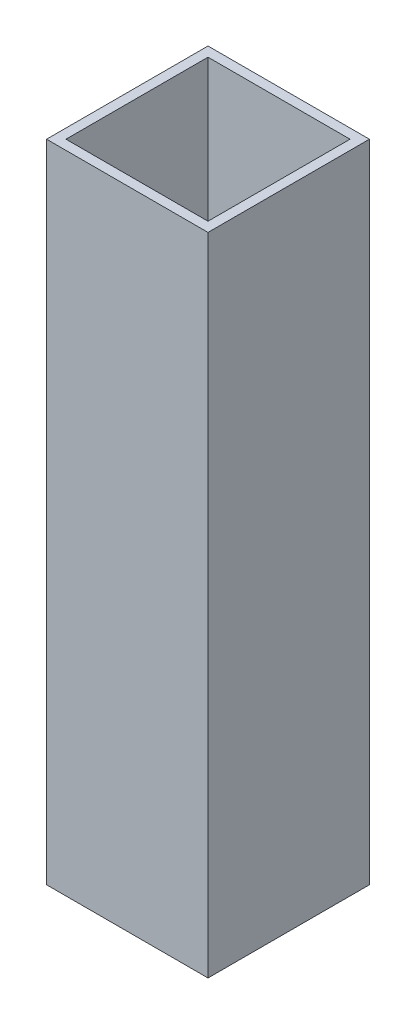
ISO-10303-21;
HEADER;
FILE_DESCRIPTION(('STEP AP214'),'2;1');
FILE_NAME('part.step','',(''),(''),'','','');
FILE_SCHEMA(('AUTOMOTIVE_DESIGN { 1 0 10303 214 1 1 1 1 }'));
ENDSEC;
DATA;
#1=APPLICATION_CONTEXT('core data for automotive mechanical design processes');
#2=APPLICATION_PROTOCOL_DEFINITION('international standard','automotive_design',2000,#1);
#3=PRODUCT_CONTEXT('',#1,'mechanical');
#4=PRODUCT('Part','Part','',(#3));
#5=PRODUCT_RELATED_PRODUCT_CATEGORY('part','',(#4));
#6=PRODUCT_DEFINITION_FORMATION('','',#4);
#7=PRODUCT_DEFINITION_CONTEXT('part definition',#1,'design');
#8=PRODUCT_DEFINITION('design','',#6,#7);
#9=PRODUCT_DEFINITION_SHAPE('','',#8);
#10=(LENGTH_UNIT() NAMED_UNIT(*) SI_UNIT(.MILLI.,.METRE.));
#11=(NAMED_UNIT(*) PLANE_ANGLE_UNIT() SI_UNIT($,.RADIAN.));
#12=(NAMED_UNIT(*) SI_UNIT($,.STERADIAN.) SOLID_ANGLE_UNIT());
#13=UNCERTAINTY_MEASURE_WITH_UNIT(LENGTH_MEASURE(1.E-05),#10,'distance_accuracy_value','');
#14=(GEOMETRIC_REPRESENTATION_CONTEXT(3) GLOBAL_UNCERTAINTY_ASSIGNED_CONTEXT((#13)) GLOBAL_UNIT_ASSIGNED_CONTEXT((#10,
#11,#12)) REPRESENTATION_CONTEXT('',''));
#15=CARTESIAN_POINT('',(0.,0.,0.));
#16=DIRECTION('',(0.,0.,1.));
#17=DIRECTION('',(1.,0.,0.));
#18=AXIS2_PLACEMENT_3D('',#15,#16,#17);
#19=CARTESIAN_POINT('',(12.5,-50.,-12.5));
#20=DIRECTION('',(1.,0.,0.));
#21=DIRECTION('',(0.,0.,-1.));
#22=AXIS2_PLACEMENT_3D('',#19,#20,#21);
#23=PLANE('',#22);
#24=DIRECTION('',(0.,1.,0.));
#25=VECTOR('',#24,1.);
#26=CARTESIAN_POINT('',(12.5,-50.,-12.5));
#27=LINE('',#26,#25);
#28=CARTESIAN_POINT('',(12.5,-50.,-12.5));
#29=VERTEX_POINT('',#28);
#30=CARTESIAN_POINT('',(12.5,50.,-12.5));
#31=VERTEX_POINT('',#30);
#32=EDGE_CURVE('E38',#29,#31,#27,.T.);
#33=ORIENTED_EDGE('',*,*,#32,.T.);
#34=DIRECTION('',(0.,0.,-1.));
#35=VECTOR('',#34,1.);
#36=CARTESIAN_POINT('',(12.5,50.,-12.5));
#37=LINE('',#36,#35);
#38=CARTESIAN_POINT('',(12.5,50.,12.5));
#39=VERTEX_POINT('',#38);
#40=EDGE_CURVE('E130',#39,#31,#37,.T.);
#41=ORIENTED_EDGE('',*,*,#40,.F.);
#42=DIRECTION('',(0.,1.,0.));
#43=VECTOR('',#42,1.);
#44=CARTESIAN_POINT('',(12.5,-50.,12.5));
#45=LINE('',#44,#43);
#46=CARTESIAN_POINT('',(12.5,-50.,12.5));
#47=VERTEX_POINT('',#46);
#48=EDGE_CURVE('E11',#47,#39,#45,.T.);
#49=ORIENTED_EDGE('',*,*,#48,.F.);
#50=DIRECTION('',(0.,0.,-1.));
#51=VECTOR('',#50,1.);
#52=CARTESIAN_POINT('',(12.5,-50.,-12.5));
#53=LINE('',#52,#51);
#54=EDGE_CURVE('E149',#47,#29,#53,.T.);
#55=ORIENTED_EDGE('',*,*,#54,.T.);
#56=EDGE_LOOP('',(#33,#41,#49,#55));
#57=FACE_BOUND('',#56,.T.);
#58=ADVANCED_FACE('F35',(#57),#23,.T.);
#59=CARTESIAN_POINT('',(-12.5,-50.,12.5));
#60=DIRECTION('',(0.,0.,1.));
#61=DIRECTION('',(1.,0.,0.));
#62=AXIS2_PLACEMENT_3D('',#59,#60,#61);
#63=PLANE('',#62);
#64=ORIENTED_EDGE('',*,*,#48,.T.);
#65=DIRECTION('',(1.,0.,0.));
#66=VECTOR('',#65,1.);
#67=CARTESIAN_POINT('',(-12.5,50.,12.5));
#68=LINE('',#67,#66);
#69=CARTESIAN_POINT('',(-12.5,50.,12.5));
#70=VERTEX_POINT('',#69);
#71=EDGE_CURVE('E139',#70,#39,#68,.T.);
#72=ORIENTED_EDGE('',*,*,#71,.F.);
#73=DIRECTION('',(0.,1.,0.));
#74=VECTOR('',#73,1.);
#75=CARTESIAN_POINT('',(-12.5,-50.,12.5));
#76=LINE('',#75,#74);
#77=CARTESIAN_POINT('',(-12.5,-50.,12.5));
#78=VERTEX_POINT('',#77);
#79=EDGE_CURVE('E43',#78,#70,#76,.T.);
#80=ORIENTED_EDGE('',*,*,#79,.F.);
#81=DIRECTION('',(1.,0.,0.));
#82=VECTOR('',#81,1.);
#83=CARTESIAN_POINT('',(-12.5,-50.,12.5));
#84=LINE('',#83,#82);
#85=EDGE_CURVE('E160',#78,#47,#84,.T.);
#86=ORIENTED_EDGE('',*,*,#85,.T.);
#87=EDGE_LOOP('',(#64,#72,#80,#86));
#88=FACE_BOUND('',#87,.T.);
#89=ADVANCED_FACE('F172',(#88),#63,.T.);
#90=CARTESIAN_POINT('',(-12.5,-50.,-12.5));
#91=DIRECTION('',(-1.,0.,0.));
#92=DIRECTION('',(0.,0.,1.));
#93=AXIS2_PLACEMENT_3D('',#90,#91,#92);
#94=PLANE('',#93);
#95=ORIENTED_EDGE('',*,*,#79,.T.);
#96=DIRECTION('',(0.,0.,1.));
#97=VECTOR('',#96,1.);
#98=CARTESIAN_POINT('',(-12.5,50.,-12.5));
#99=LINE('',#98,#97);
#100=CARTESIAN_POINT('',(-12.5,50.,-12.5));
#101=VERTEX_POINT('',#100);
#102=EDGE_CURVE('E136',#101,#70,#99,.T.);
#103=ORIENTED_EDGE('',*,*,#102,.F.);
#104=DIRECTION('',(0.,1.,0.));
#105=VECTOR('',#104,1.);
#106=CARTESIAN_POINT('',(-12.5,-50.,-12.5));
#107=LINE('',#106,#105);
#108=CARTESIAN_POINT('',(-12.5,-50.,-12.5));
#109=VERTEX_POINT('',#108);
#110=EDGE_CURVE('E163',#109,#101,#107,.T.);
#111=ORIENTED_EDGE('',*,*,#110,.F.);
#112=DIRECTION('',(0.,0.,1.));
#113=VECTOR('',#112,1.);
#114=CARTESIAN_POINT('',(-12.5,-50.,-12.5));
#115=LINE('',#114,#113);
#116=EDGE_CURVE('E157',#109,#78,#115,.T.);
#117=ORIENTED_EDGE('',*,*,#116,.T.);
#118=EDGE_LOOP('',(#95,#103,#111,#117));
#119=FACE_BOUND('',#118,.T.);
#120=ADVANCED_FACE('F178',(#119),#94,.T.);
#121=CARTESIAN_POINT('',(-12.5,-50.,-12.5));
#122=DIRECTION('',(0.,0.,-1.));
#123=DIRECTION('',(-1.,0.,0.));
#124=AXIS2_PLACEMENT_3D('',#121,#122,#123);
#125=PLANE('',#124);
#126=ORIENTED_EDGE('',*,*,#110,.T.);
#127=DIRECTION('',(-1.,0.,0.));
#128=VECTOR('',#127,1.);
#129=CARTESIAN_POINT('',(-12.5,50.,-12.5));
#130=LINE('',#129,#128);
#131=EDGE_CURVE('E133',#31,#101,#130,.T.);
#132=ORIENTED_EDGE('',*,*,#131,.F.);
#133=ORIENTED_EDGE('',*,*,#32,.F.);
#134=DIRECTION('',(-1.,0.,0.));
#135=VECTOR('',#134,1.);
#136=CARTESIAN_POINT('',(-12.5,-50.,-12.5));
#137=LINE('',#136,#135);
#138=EDGE_CURVE('E154',#29,#109,#137,.T.);
#139=ORIENTED_EDGE('',*,*,#138,.T.);
#140=EDGE_LOOP('',(#126,#132,#133,#139));
#141=FACE_BOUND('',#140,.T.);
#142=ADVANCED_FACE('F167',(#141),#125,.T.);
#143=CARTESIAN_POINT('',(0.,-50.,0.));
#144=DIRECTION('',(0.,1.,0.));
#145=DIRECTION('',(0.,0.,1.));
#146=AXIS2_PLACEMENT_3D('',#143,#144,#145);
#147=PLANE('',#146);
#148=DIRECTION('',(1.,0.,0.));
#149=VECTOR('',#148,1.);
#150=CARTESIAN_POINT('',(-11.,-50.,11.));
#151=LINE('',#150,#149);
#152=CARTESIAN_POINT('',(-11.,-50.,11.));
#153=VERTEX_POINT('',#152);
#154=CARTESIAN_POINT('',(11.,-50.,11.));
#155=VERTEX_POINT('',#154);
#156=EDGE_CURVE('E112',#153,#155,#151,.T.);
#157=ORIENTED_EDGE('',*,*,#156,.T.);
#158=DIRECTION('',(0.,0.,-1.));
#159=VECTOR('',#158,1.);
#160=CARTESIAN_POINT('',(11.,-50.,-11.));
#161=LINE('',#160,#159);
#162=CARTESIAN_POINT('',(11.,-50.,-11.));
#163=VERTEX_POINT('',#162);
#164=EDGE_CURVE('E142',#155,#163,#161,.T.);
#165=ORIENTED_EDGE('',*,*,#164,.T.);
#166=DIRECTION('',(-1.,0.,0.));
#167=VECTOR('',#166,1.);
#168=CARTESIAN_POINT('',(-11.,-50.,-11.));
#169=LINE('',#168,#167);
#170=CARTESIAN_POINT('',(-11.,-50.,-11.));
#171=VERTEX_POINT('',#170);
#172=EDGE_CURVE('E107',#163,#171,#169,.T.);
#173=ORIENTED_EDGE('',*,*,#172,.T.);
#174=DIRECTION('',(0.,0.,1.));
#175=VECTOR('',#174,1.);
#176=CARTESIAN_POINT('',(-11.,-50.,-11.));
#177=LINE('',#176,#175);
#178=EDGE_CURVE('E51',#171,#153,#177,.T.);
#179=ORIENTED_EDGE('',*,*,#178,.T.);
#180=EDGE_LOOP('',(#157,#165,#173,#179));
#181=FACE_BOUND('',#180,.T.);
#182=ORIENTED_EDGE('',*,*,#54,.F.);
#183=ORIENTED_EDGE('',*,*,#85,.F.);
#184=ORIENTED_EDGE('',*,*,#116,.F.);
#185=ORIENTED_EDGE('',*,*,#138,.F.);
#186=EDGE_LOOP('',(#182,#183,#184,#185));
#187=FACE_BOUND('',#186,.T.);
#188=ADVANCED_FACE('F176',(#181,#187),#147,.F.);
#189=CARTESIAN_POINT('',(11.,-50.,-11.));
#190=DIRECTION('',(1.,0.,0.));
#191=DIRECTION('',(0.,0.,-1.));
#192=AXIS2_PLACEMENT_3D('',#189,#190,#191);
#193=PLANE('',#192);
#194=DIRECTION('',(0.,1.,0.));
#195=VECTOR('',#194,1.);
#196=CARTESIAN_POINT('',(11.,-50.,11.));
#197=LINE('',#196,#195);
#198=CARTESIAN_POINT('',(11.,50.,11.));
#199=VERTEX_POINT('',#198);
#200=EDGE_CURVE('E117',#155,#199,#197,.T.);
#201=ORIENTED_EDGE('',*,*,#200,.T.);
#202=DIRECTION('',(0.,0.,-1.));
#203=VECTOR('',#202,1.);
#204=CARTESIAN_POINT('',(11.,50.,-11.));
#205=LINE('',#204,#203);
#206=CARTESIAN_POINT('',(11.,50.,-11.));
#207=VERTEX_POINT('',#206);
#208=EDGE_CURVE('E115',#199,#207,#205,.T.);
#209=ORIENTED_EDGE('',*,*,#208,.T.);
#210=DIRECTION('',(0.,1.,0.));
#211=VECTOR('',#210,1.);
#212=CARTESIAN_POINT('',(11.,-50.,-11.));
#213=LINE('',#212,#211);
#214=EDGE_CURVE('E100',#163,#207,#213,.T.);
#215=ORIENTED_EDGE('',*,*,#214,.F.);
#216=ORIENTED_EDGE('',*,*,#164,.F.);
#217=EDGE_LOOP('',(#201,#209,#215,#216));
#218=FACE_BOUND('',#217,.T.);
#219=ADVANCED_FACE('F116',(#218),#193,.F.);
#220=CARTESIAN_POINT('',(-11.,-50.,11.));
#221=DIRECTION('',(0.,0.,1.));
#222=DIRECTION('',(1.,0.,0.));
#223=AXIS2_PLACEMENT_3D('',#220,#221,#222);
#224=PLANE('',#223);
#225=DIRECTION('',(0.,1.,0.));
#226=VECTOR('',#225,1.);
#227=CARTESIAN_POINT('',(-11.,-50.,11.));
#228=LINE('',#227,#226);
#229=CARTESIAN_POINT('',(-11.,50.,11.));
#230=VERTEX_POINT('',#229);
#231=EDGE_CURVE('E150',#153,#230,#228,.T.);
#232=ORIENTED_EDGE('',*,*,#231,.T.);
#233=DIRECTION('',(1.,0.,0.));
#234=VECTOR('',#233,1.);
#235=CARTESIAN_POINT('',(-11.,50.,11.));
#236=LINE('',#235,#234);
#237=EDGE_CURVE('E126',#230,#199,#236,.T.);
#238=ORIENTED_EDGE('',*,*,#237,.T.);
#239=ORIENTED_EDGE('',*,*,#200,.F.);
#240=ORIENTED_EDGE('',*,*,#156,.F.);
#241=EDGE_LOOP('',(#232,#238,#239,#240));
#242=FACE_BOUND('',#241,.T.);
#243=ADVANCED_FACE('F221',(#242),#224,.F.);
#244=CARTESIAN_POINT('',(-11.,-50.,-11.));
#245=DIRECTION('',(-1.,0.,0.));
#246=DIRECTION('',(0.,0.,1.));
#247=AXIS2_PLACEMENT_3D('',#244,#245,#246);
#248=PLANE('',#247);
#249=DIRECTION('',(0.,1.,0.));
#250=VECTOR('',#249,1.);
#251=CARTESIAN_POINT('',(-11.,-50.,-11.));
#252=LINE('',#251,#250);
#253=CARTESIAN_POINT('',(-11.,50.,-11.));
#254=VERTEX_POINT('',#253);
#255=EDGE_CURVE('E111',#171,#254,#252,.T.);
#256=ORIENTED_EDGE('',*,*,#255,.T.);
#257=DIRECTION('',(0.,0.,1.));
#258=VECTOR('',#257,1.);
#259=CARTESIAN_POINT('',(-11.,50.,-11.));
#260=LINE('',#259,#258);
#261=EDGE_CURVE('E124',#254,#230,#260,.T.);
#262=ORIENTED_EDGE('',*,*,#261,.T.);
#263=ORIENTED_EDGE('',*,*,#231,.F.);
#264=ORIENTED_EDGE('',*,*,#178,.F.);
#265=EDGE_LOOP('',(#256,#262,#263,#264));
#266=FACE_BOUND('',#265,.T.);
#267=ADVANCED_FACE('F230',(#266),#248,.F.);
#268=CARTESIAN_POINT('',(-11.,-50.,-11.));
#269=DIRECTION('',(0.,0.,-1.));
#270=DIRECTION('',(-1.,0.,0.));
#271=AXIS2_PLACEMENT_3D('',#268,#269,#270);
#272=PLANE('',#271);
#273=ORIENTED_EDGE('',*,*,#214,.T.);
#274=DIRECTION('',(-1.,0.,0.));
#275=VECTOR('',#274,1.);
#276=CARTESIAN_POINT('',(-11.,50.,-11.));
#277=LINE('',#276,#275);
#278=EDGE_CURVE('E104',#207,#254,#277,.T.);
#279=ORIENTED_EDGE('',*,*,#278,.T.);
#280=ORIENTED_EDGE('',*,*,#255,.F.);
#281=ORIENTED_EDGE('',*,*,#172,.F.);
#282=EDGE_LOOP('',(#273,#279,#280,#281));
#283=FACE_BOUND('',#282,.T.);
#284=ADVANCED_FACE('F102',(#283),#272,.F.);
#285=CARTESIAN_POINT('',(0.,50.,0.));
#286=DIRECTION('',(0.,1.,0.));
#287=DIRECTION('',(0.,0.,1.));
#288=AXIS2_PLACEMENT_3D('',#285,#286,#287);
#289=PLANE('',#288);
#290=ORIENTED_EDGE('',*,*,#40,.T.);
#291=ORIENTED_EDGE('',*,*,#131,.T.);
#292=ORIENTED_EDGE('',*,*,#102,.T.);
#293=ORIENTED_EDGE('',*,*,#71,.T.);
#294=EDGE_LOOP('',(#290,#291,#292,#293));
#295=FACE_BOUND('',#294,.T.);
#296=ORIENTED_EDGE('',*,*,#278,.F.);
#297=ORIENTED_EDGE('',*,*,#208,.F.);
#298=ORIENTED_EDGE('',*,*,#237,.F.);
#299=ORIENTED_EDGE('',*,*,#261,.F.);
#300=EDGE_LOOP('',(#296,#297,#298,#299));
#301=FACE_BOUND('',#300,.T.);
#302=ADVANCED_FACE('F122',(#295,#301),#289,.T.);
#303=CLOSED_SHELL('',(#58,#89,#120,#142,#188,#219,#243,#267,#284,#302));
#304=MANIFOLD_SOLID_BREP('B2',#303);
#305=ADVANCED_BREP_SHAPE_REPRESENTATION('',(#18,#304),#14);
#306=SHAPE_DEFINITION_REPRESENTATION(#9,#305);
ENDSEC;
END-ISO-10303-21;
